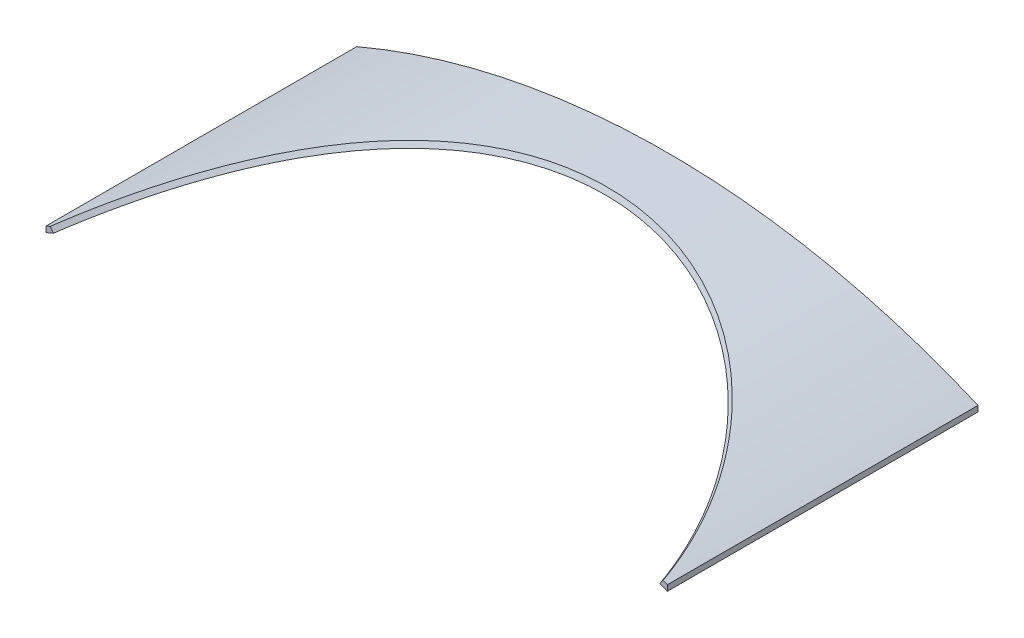
ISO-10303-21;
HEADER;
FILE_DESCRIPTION(('STEP AP214'),'2;1');
FILE_NAME('part.step','',(''),(''),'','','');
FILE_SCHEMA(('AUTOMOTIVE_DESIGN { 1 0 10303 214 1 1 1 1 }'));
ENDSEC;
DATA;
#1=APPLICATION_CONTEXT('core data for automotive mechanical design processes');
#2=APPLICATION_PROTOCOL_DEFINITION('international standard','automotive_design',2000,#1);
#3=PRODUCT_CONTEXT('',#1,'mechanical');
#4=PRODUCT('Part','Part','',(#3));
#5=PRODUCT_RELATED_PRODUCT_CATEGORY('part','',(#4));
#6=PRODUCT_DEFINITION_FORMATION('','',#4);
#7=PRODUCT_DEFINITION_CONTEXT('part definition',#1,'design');
#8=PRODUCT_DEFINITION('design','',#6,#7);
#9=PRODUCT_DEFINITION_SHAPE('','',#8);
#10=(LENGTH_UNIT() NAMED_UNIT(*) SI_UNIT(.MILLI.,.METRE.));
#11=(NAMED_UNIT(*) PLANE_ANGLE_UNIT() SI_UNIT($,.RADIAN.));
#12=(NAMED_UNIT(*) SI_UNIT($,.STERADIAN.) SOLID_ANGLE_UNIT());
#13=UNCERTAINTY_MEASURE_WITH_UNIT(LENGTH_MEASURE(1.E-05),#10,'distance_accuracy_value','');
#14=(GEOMETRIC_REPRESENTATION_CONTEXT(3) GLOBAL_UNCERTAINTY_ASSIGNED_CONTEXT((#13)) GLOBAL_UNIT_ASSIGNED_CONTEXT((#10,
#11,#12)) REPRESENTATION_CONTEXT('',''));
#15=CARTESIAN_POINT('',(0.,0.,0.));
#16=DIRECTION('',(0.,0.,1.));
#17=DIRECTION('',(1.,0.,0.));
#18=AXIS2_PLACEMENT_3D('',#15,#16,#17);
#19=CARTESIAN_POINT('',(0.,0.,118.));
#20=DIRECTION('',(0.,0.,1.));
#21=DIRECTION('',(1.,0.,0.));
#22=AXIS2_PLACEMENT_3D('',#19,#20,#21);
#23=PLANE('',#22);
#24=CARTESIAN_POINT('',(0.,363.,118.));
#25=DIRECTION('',(0.,0.,1.));
#26=DIRECTION('',(1.,0.,0.));
#27=AXIS2_PLACEMENT_3D('',#24,#25,#26);
#28=CIRCLE('',#27,145.041373407728);
#29=CARTESIAN_POINT('',(-116.417704250501,276.490358126722,118.));
#30=VERTEX_POINT('',#29);
#31=CARTESIAN_POINT('',(-115.175253329775,274.842975206612,118.));
#32=VERTEX_POINT('',#31);
#33=EDGE_CURVE('E11',#30,#32,#28,.T.);
#34=ORIENTED_EDGE('',*,*,#33,.F.);
#35=CARTESIAN_POINT('',(0.,0.,118.));
#36=DIRECTION('',(0.,0.,1.));
#37=DIRECTION('',(1.,0.,0.));
#38=AXIS2_PLACEMENT_3D('',#35,#36,#37);
#39=CIRCLE('',#38,300.);
#40=CARTESIAN_POINT('',(-118.,275.818781086423,118.));
#41=VERTEX_POINT('',#40);
#42=EDGE_CURVE('E106',#30,#41,#39,.T.);
#43=ORIENTED_EDGE('',*,*,#42,.T.);
#44=DIRECTION('',(0.,-1.,0.));
#45=VECTOR('',#44,1.);
#46=CARTESIAN_POINT('',(-118.,275.818781086423,118.));
#47=LINE('',#46,#45);
#48=CARTESIAN_POINT('',(-118.,273.642102023793,118.));
#49=VERTEX_POINT('',#48);
#50=EDGE_CURVE('E57',#41,#49,#47,.T.);
#51=ORIENTED_EDGE('',*,*,#50,.T.);
#52=CARTESIAN_POINT('',(0.,0.,118.));
#53=DIRECTION('',(0.,0.,-1.));
#54=DIRECTION('',(1.,0.,0.));
#55=AXIS2_PLACEMENT_3D('',#52,#53,#54);
#56=CIRCLE('',#55,298.);
#57=EDGE_CURVE('E140',#49,#32,#56,.T.);
#58=ORIENTED_EDGE('',*,*,#57,.T.);
#59=EDGE_LOOP('',(#34,#43,#51,#58));
#60=FACE_BOUND('',#59,.T.);
#61=ADVANCED_FACE('F33',(#60),#23,.T.);
#62=CARTESIAN_POINT('',(0.,0.,118.));
#63=DIRECTION('',(0.,0.,-1.));
#64=DIRECTION('',(-1.,0.,0.));
#65=AXIS2_PLACEMENT_3D('',#62,#63,#64);
#66=CYLINDRICAL_SURFACE('',#65,298.);
#67=CARTESIAN_POINT('',(115.175253329775,274.842975206611,118.));
#68=VERTEX_POINT('',#67);
#69=CARTESIAN_POINT('',(118.,273.642102023793,118.));
#70=VERTEX_POINT('',#69);
#71=EDGE_CURVE('E85',#68,#70,#56,.T.);
#72=ORIENTED_EDGE('',*,*,#71,.F.);
#73=CARTESIAN_POINT('',(115.175308549847,274.842952066171,118.0002));
#74=CARTESIAN_POINT('',(114.66897841973,275.055106732479,116.166314201416));
#75=CARTESIAN_POINT('',(114.128550269055,275.27995946752,114.343294599605));
#76=CARTESIAN_POINT('',(112.979586120452,275.753518994483,110.721934496561));
#77=CARTESIAN_POINT('',(112.371048376963,276.002226397747,108.923594629164));
#78=CARTESIAN_POINT('',(111.085798763114,276.522015120785,105.354133894913));
#79=CARTESIAN_POINT('',(110.409067795394,276.793102704216,103.583020813803));
#80=CARTESIAN_POINT('',(108.987734953418,277.35583300134,100.071568256163));
#81=CARTESIAN_POINT('',(108.243133547752,277.647475573113,98.3312285672654));
#82=CARTESIAN_POINT('',(106.683356711757,278.250540067916,94.8779249449304));
#83=CARTESIAN_POINT('',(105.867928179551,278.562031769986,93.1650874730216));
#84=CARTESIAN_POINT('',(104.169104167577,279.2017578783,89.7764484711956));
#85=CARTESIAN_POINT('',(103.28570284562,279.529993722868,88.1006501407236));
#86=CARTESIAN_POINT('',(101.451468470111,280.200915448368,84.7895945176731));
#87=CARTESIAN_POINT('',(100.500643627797,280.54359956765,83.154332320988));
#88=CARTESIAN_POINT('',(98.5319313079616,281.241087046759,79.9273291582587));
#89=CARTESIAN_POINT('',(97.5140439383907,281.595890387077,78.335588122165));
#90=CARTESIAN_POINT('',(95.4091877038589,282.316005834295,75.194975257715));
#91=CARTESIAN_POINT('',(94.3220543596696,282.681341741152,73.6462190732661));
#92=CARTESIAN_POINT('',(92.0817015594629,283.419037855295,70.5989767988226));
#93=CARTESIAN_POINT('',(90.9284821822012,283.79139805421,69.1004906489239));
#94=CARTESIAN_POINT('',(88.5567651981955,284.540411695003,66.1570189600167));
#95=CARTESIAN_POINT('',(87.3382632860796,284.917065418745,64.7120369602517));
#96=CARTESIAN_POINT('',(84.8371481893643,285.671777517457,61.8790699056484));
#97=CARTESIAN_POINT('',(83.5545361876319,286.04983586639,60.4910838000642));
#98=CARTESIAN_POINT('',(80.9282732982512,286.803902349031,57.7773423397922));
#99=CARTESIAN_POINT('',(79.5847087182512,287.179912586302,56.4515040833825));
#100=CARTESIAN_POINT('',(76.8365773617404,287.927365459398,53.8635710355947));
#101=CARTESIAN_POINT('',(75.432017405663,288.298808599982,52.6014691512489));
#102=CARTESIAN_POINT('',(72.5635522762699,289.034120787371,50.1442708899135));
#103=CARTESIAN_POINT('',(71.0996476279946,289.397989901143,48.9491739203338));
#104=CARTESIAN_POINT('',(68.1145637856306,290.115084447046,46.6293833573409));
#105=CARTESIAN_POINT('',(66.5933855410018,290.468310055447,45.5046885976488));
#106=CARTESIAN_POINT('',(63.5914902766043,291.139726036997,43.3960407858707));
#107=CARTESIAN_POINT('',(62.1140471429469,291.458734585268,42.407685855765));
#108=CARTESIAN_POINT('',(59.11308041912,292.082166760186,40.4986854790912));
#109=CARTESIAN_POINT('',(57.5895580335987,292.386590767578,39.5780382645983));
#110=CARTESIAN_POINT('',(54.4989004294266,292.978404324741,37.8070964153569));
#111=CARTESIAN_POINT('',(52.9317648387301,293.265793729132,36.9568023810076));
#112=CARTESIAN_POINT('',(49.7566798321898,293.821153265151,35.3291547475753));
#113=CARTESIAN_POINT('',(48.1487303843934,294.089123381576,34.5518012055985));
#114=CARTESIAN_POINT('',(44.8957577319608,294.603260832525,33.0728000747533));
#115=CARTESIAN_POINT('',(43.2507498499232,294.84943697796,32.371121866439));
#116=CARTESIAN_POINT('',(39.9263739012073,295.31796815764,31.0454175268877));
#117=CARTESIAN_POINT('',(38.247005584161,295.540323018237,30.4213919617028));
#118=CARTESIAN_POINT('',(34.8577455254764,295.959208144075,29.2531977386706));
#119=CARTESIAN_POINT('',(33.1478570668565,296.155741168153,28.7090205489965));
#120=CARTESIAN_POINT('',(29.7013116922524,296.521221423032,27.7023801482195));
#121=CARTESIAN_POINT('',(27.9646556628953,296.690169565391,27.2399142368758));
#122=CARTESIAN_POINT('',(24.6775334062865,296.980483022331,26.4486325062073));
#123=CARTESIAN_POINT('',(23.1296029995753,297.105121409583,26.1104510849546));
#124=CARTESIAN_POINT('',(20.0191601453432,297.33090058023,25.4997131737778));
#125=CARTESIAN_POINT('',(18.4566479928785,297.432041838012,25.2271553589623));
#126=CARTESIAN_POINT('',(15.3202299052758,297.610076435533,24.7484832704441));
#127=CARTESIAN_POINT('',(13.7463248602079,297.686971649019,24.5423638623165));
#128=CARTESIAN_POINT('',(10.5901548564037,297.815955090222,24.1971531598187));
#129=CARTESIAN_POINT('',(9.00788984887605,297.868043172995,24.058062257086));
#130=CARTESIAN_POINT('',(5.83898830585452,297.947003808544,23.8473802501396));
#131=CARTESIAN_POINT('',(4.25235416618387,297.973888165373,23.7757575474205));
#132=CARTESIAN_POINT('',(1.07724389004472,298.002281982863,23.7001168136886));
#133=CARTESIAN_POINT('',(-0.511232249727341,298.003791397944,23.6960989041108));
#134=CARTESIAN_POINT('',(-3.68669682485292,297.981424351142,23.7556791833742));
#135=CARTESIAN_POINT('',(-5.27368529417565,297.957548483767,23.819275788723));
#136=CARTESIAN_POINT('',(-8.44292612764633,297.884590485192,24.0138897458434));
#137=CARTESIAN_POINT('',(-10.025178556367,297.835508699247,24.1449061741402));
#138=CARTESIAN_POINT('',(-13.074560546064,297.716683402206,24.4627890818848));
#139=CARTESIAN_POINT('',(-14.5422140612284,297.648568576704,24.6452607389529));
#140=CARTESIAN_POINT('',(-17.4681710414628,297.491192526169,25.0679783544484));
#141=CARTESIAN_POINT('',(-18.9264736799133,297.401929457389,25.3082293502205));
#142=CARTESIAN_POINT('',(-21.8308584568609,297.202846740326,25.8458388609386));
#143=CARTESIAN_POINT('',(-23.2769424507262,297.093030273856,26.1431885367816));
#144=CARTESIAN_POINT('',(-26.1548287598421,296.853516138368,26.794299323173));
#145=CARTESIAN_POINT('',(-27.5866297363467,296.723816624019,27.1480656698322));
#146=CARTESIAN_POINT('',(-30.433392240496,296.445364175026,27.9110908948503));
#147=CARTESIAN_POINT('',(-31.848354799112,296.296612413529,28.3203463565456));
#148=CARTESIAN_POINT('',(-34.6594288811817,295.98095318385,29.1934154377221));
#149=CARTESIAN_POINT('',(-36.0555386946594,295.814044081038,29.6572339696029));
#150=CARTESIAN_POINT('',(-38.8265728514221,295.463106983027,30.6382736830924));
#151=CARTESIAN_POINT('',(-40.2014985699297,295.27908010458,31.1554913812208));
#152=CARTESIAN_POINT('',(-42.9283868634086,294.894980785821,32.242216320245));
#153=CARTESIAN_POINT('',(-44.2803473225009,294.694906876647,32.8117283485886));
#154=CARTESIAN_POINT('',(-46.9892501676626,294.275263412604,34.015035633433));
#155=CARTESIAN_POINT('',(-48.345628770466,294.055358110557,34.649982992217));
#156=CARTESIAN_POINT('',(-51.0305571116408,293.601322000853,35.9717911704633));
#157=CARTESIAN_POINT('',(-52.3591043228227,293.367189908818,36.6586566784066));
#158=CARTESIAN_POINT('',(-54.986431242957,292.886113701658,38.0827107669379));
#159=CARTESIAN_POINT('',(-56.2852136701616,292.639170763252,38.819894727562));
#160=CARTESIAN_POINT('',(-58.8515908208503,292.13387602647,40.3430982766483));
#161=CARTESIAN_POINT('',(-60.1191828652749,291.875523253351,41.1291220398456));
#162=CARTESIAN_POINT('',(-63.8728544254236,291.085543157303,43.5580574129447));
#163=CARTESIAN_POINT('',(-66.3102973691088,290.538907536634,45.2720872873599));
#164=CARTESIAN_POINT('',(-71.0441687898318,289.417772420198,48.8759716155518));
#165=CARTESIAN_POINT('',(-73.3405914560676,288.843271777985,50.7658333064959));
#166=CARTESIAN_POINT('',(-77.9866673615267,287.625377945395,54.8874589636108));
#167=CARTESIAN_POINT('',(-80.322223125304,286.980465632099,57.134686435436));
#168=CARTESIAN_POINT('',(-84.8083805247498,285.686875621639,61.8056719149378));
#169=CARTESIAN_POINT('',(-86.9589689697821,285.038197659449,64.2294424897658));
#170=CARTESIAN_POINT('',(-91.070935013764,283.751177498344,69.2385958184851));
#171=CARTESIAN_POINT('',(-93.0321451491043,283.112844855178,71.8241183373784));
#172=CARTESIAN_POINT('',(-96.758806453462,281.860955147733,77.1379981270734));
#173=CARTESIAN_POINT('',(-98.5242648585508,281.247397168178,79.8663501126124));
#174=CARTESIAN_POINT('',(-101.828410226228,280.067849781153,85.4024612527316));
#175=CARTESIAN_POINT('',(-103.370411650803,279.501233911959,88.2081132659726));
#176=CARTESIAN_POINT('',(-106.260577033823,278.415290833082,93.9267572425969));
#177=CARTESIAN_POINT('',(-107.608733267477,277.895965508245,96.8397534778729));
#178=CARTESIAN_POINT('',(-109.482908881385,277.160495483992,101.274349357237));
#179=CARTESIAN_POINT('',(-110.082406286102,276.922818315896,102.761804461528));
#180=CARTESIAN_POINT('',(-111.232738180094,276.462767717848,105.757834393601));
#181=CARTESIAN_POINT('',(-111.783572478272,276.240394347993,107.266409304293));
#182=CARTESIAN_POINT('',(-112.836373379096,275.812030628929,110.302535508962));
#183=CARTESIAN_POINT('',(-113.338347181424,275.606037866828,111.830083969633));
#184=CARTESIAN_POINT('',(-114.293462059005,275.211317907298,114.902555265956));
#185=CARTESIAN_POINT('',(-114.746603859006,275.022590453631,116.447477843373));
#186=CARTESIAN_POINT('',(-115.175308549847,274.842952066171,118.0002));
#187=B_SPLINE_CURVE_WITH_KNOTS('',3,(#73,#74,#75,#76,#77,#78,#79,#80,#81,#82,#83,#84,#85,#86,
#87,#88,#89,#90,#91,#92,#93,#94,#95,#96,#97,#98,#99,#100,#101,#102,#103,#104,#105,#106,#107,
#108,#109,#110,#111,#112,#113,#114,#115,#116,#117,#118,#119,#120,#121,#122,#123,#124,#125,#126,
#127,#128,#129,#130,#131,#132,#133,#134,#135,#136,#137,#138,#139,#140,#141,#142,#143,#144,#145,
#146,#147,#148,#149,#150,#151,#152,#153,#154,#155,#156,#157,#158,#159,#160,#161,#162,#163,#164,
#165,#166,#167,#168,#169,#170,#171,#172,#173,#174,#175,#176,#177,#178,#179,#180,#181,#182,#183,
#184,#185,#186),.UNSPECIFIED.,.F.,.F.,(4,2,2,2,2,2,2,2,2,2,2,2,2,2,2,2,2,2,2,2,2,2,2,2,2,2,2,2,
2,2,2,2,2,2,2,2,2,2,2,2,2,2,2,2,2,2,2,2,2,2,2,2,2,2,2,2,4),(0.,5.74252717555168,
11.4852015584251,17.2294886576759,22.9737361002848,28.7394290521477,34.5056181140294,
40.2711061372484,46.0365848800763,51.8163095728418,57.5960273779804,63.3761268248623,
69.1561196650277,74.9281691113892,80.6995747873305,86.4709294130242,92.2421884054708,
97.6581698371427,103.074009801199,108.489895979666,113.905786398275,119.31947717437,
124.733207411468,130.146358767708,135.559331206823,140.325793708451,145.0921599707,
149.858157795159,154.62418346629,159.387975873848,164.151776838363,168.915466239902,
173.679090393118,178.119357329434,182.560011519554,186.999978832099,191.44035846436,
195.880464810606,200.320971213044,204.761188123054,209.201811932631,213.7416672392,
218.281933009445,222.821782476707,227.362020537092,236.440882342242,245.520117995182,
255.423689178059,265.327966033034,275.240922349901,285.153512106573,294.899393636167,
304.645663434618,309.508610139681,314.371575940415,319.233824086072,324.096000058019),.UNSPECIFIED.);
#188=EDGE_CURVE('E48',#68,#32,#187,.T.);
#189=ORIENTED_EDGE('',*,*,#188,.T.);
#190=ORIENTED_EDGE('',*,*,#57,.F.);
#191=DIRECTION('',(0.,0.,-1.));
#192=VECTOR('',#191,1.);
#193=CARTESIAN_POINT('',(-118.,273.642102023793,118.));
#194=LINE('',#193,#192);
#195=CARTESIAN_POINT('',(-118.,273.642102023793,0.));
#196=VERTEX_POINT('',#195);
#197=EDGE_CURVE('E112',#49,#196,#194,.T.);
#198=ORIENTED_EDGE('',*,*,#197,.T.);
#199=CARTESIAN_POINT('',(0.,0.,0.));
#200=DIRECTION('',(0.,0.,-1.));
#201=DIRECTION('',(1.,0.,0.));
#202=AXIS2_PLACEMENT_3D('',#199,#200,#201);
#203=CIRCLE('',#202,298.);
#204=CARTESIAN_POINT('',(118.,273.642102023793,0.));
#205=VERTEX_POINT('',#204);
#206=EDGE_CURVE('E117',#196,#205,#203,.T.);
#207=ORIENTED_EDGE('',*,*,#206,.T.);
#208=DIRECTION('',(0.,0.,-1.));
#209=VECTOR('',#208,1.);
#210=CARTESIAN_POINT('',(118.,273.642102023793,118.));
#211=LINE('',#210,#209);
#212=EDGE_CURVE('E98',#70,#205,#211,.T.);
#213=ORIENTED_EDGE('',*,*,#212,.F.);
#214=EDGE_LOOP('',(#72,#189,#190,#198,#207,#213));
#215=FACE_BOUND('',#214,.T.);
#216=ADVANCED_FACE('F35',(#215),#66,.F.);
#217=CARTESIAN_POINT('',(118.,275.818781086423,118.));
#218=DIRECTION('',(-1.,0.,0.));
#219=DIRECTION('',(0.,0.,1.));
#220=AXIS2_PLACEMENT_3D('',#217,#218,#219);
#221=PLANE('',#220);
#222=DIRECTION('',(0.,1.,0.));
#223=VECTOR('',#222,1.);
#224=CARTESIAN_POINT('',(118.,275.818781086423,0.));
#225=LINE('',#224,#223);
#226=CARTESIAN_POINT('',(118.,275.818781086423,0.));
#227=VERTEX_POINT('',#226);
#228=EDGE_CURVE('E120',#205,#227,#225,.T.);
#229=ORIENTED_EDGE('',*,*,#228,.T.);
#230=DIRECTION('',(0.,0.,-1.));
#231=VECTOR('',#230,1.);
#232=CARTESIAN_POINT('',(118.,275.818781086423,118.));
#233=LINE('',#232,#231);
#234=CARTESIAN_POINT('',(118.,275.818781086423,118.));
#235=VERTEX_POINT('',#234);
#236=EDGE_CURVE('E128',#235,#227,#233,.T.);
#237=ORIENTED_EDGE('',*,*,#236,.F.);
#238=DIRECTION('',(0.,1.,0.));
#239=VECTOR('',#238,1.);
#240=CARTESIAN_POINT('',(118.,275.818781086423,118.));
#241=LINE('',#240,#239);
#242=EDGE_CURVE('E109',#70,#235,#241,.T.);
#243=ORIENTED_EDGE('',*,*,#242,.F.);
#244=ORIENTED_EDGE('',*,*,#212,.T.);
#245=EDGE_LOOP('',(#229,#237,#243,#244));
#246=FACE_BOUND('',#245,.T.);
#247=ADVANCED_FACE('F132',(#246),#221,.F.);
#248=CARTESIAN_POINT('',(0.,0.,118.));
#249=DIRECTION('',(0.,0.,-1.));
#250=DIRECTION('',(-1.,0.,0.));
#251=AXIS2_PLACEMENT_3D('',#248,#249,#250);
#252=CYLINDRICAL_SURFACE('',#251,300.);
#253=ORIENTED_EDGE('',*,*,#42,.F.);
#254=CARTESIAN_POINT('',(-116.417759208697,276.490334986281,118.0002));
#255=CARTESIAN_POINT('',(-115.909658106234,276.704245998477,116.151129075709));
#256=CARTESIAN_POINT('',(-115.367084597402,276.931077552628,114.313009154518));
#257=CARTESIAN_POINT('',(-114.213101238512,277.409015054603,110.661654932138));
#258=CARTESIAN_POINT('',(-113.601689715243,277.660121592447,108.84842123705));
#259=CARTESIAN_POINT('',(-112.309990853207,278.18510199247,105.249432201249));
#260=CARTESIAN_POINT('',(-111.629685142222,278.458981924197,103.463684337294));
#261=CARTESIAN_POINT('',(-110.200516475354,279.027665135899,99.9232309283157));
#262=CARTESIAN_POINT('',(-109.451653972854,279.322468277502,98.1685251780942));
#263=CARTESIAN_POINT('',(-107.882800184475,279.932156240128,94.6870103766582));
#264=CARTESIAN_POINT('',(-107.062564282148,280.247109058601,92.9603234221132));
#265=CARTESIAN_POINT('',(-105.353503848429,280.894062127361,89.5442927934284));
#266=CARTESIAN_POINT('',(-104.464673393958,281.226063848975,87.8549523603664));
#267=CARTESIAN_POINT('',(-102.618984305304,281.904790139616,84.5171370283097));
#268=CARTESIAN_POINT('',(-101.662133788835,282.251512949803,82.8686572844443));
#269=CARTESIAN_POINT('',(-99.680801850174,282.957317721015,79.6155589539896));
#270=CARTESIAN_POINT('',(-98.6563205182491,283.316399665545,78.0109403088635));
#271=CARTESIAN_POINT('',(-96.5377932647405,284.045264488306,74.8450009694068));
#272=CARTESIAN_POINT('',(-95.4435862378614,284.415070987589,73.2837934732279));
#273=CARTESIAN_POINT('',(-93.1885804651262,285.161882272405,70.2119965670364));
#274=CARTESIAN_POINT('',(-92.0277817948095,285.538887049773,68.7014070996074));
#275=CARTESIAN_POINT('',(-89.6404301568817,286.297331430915,65.7340778820446));
#276=CARTESIAN_POINT('',(-88.4138729713182,286.678771317939,64.2773415963686));
#277=CARTESIAN_POINT('',(-85.8961966181232,287.443166635782,61.421207279881));
#278=CARTESIAN_POINT('',(-84.6050786161198,287.826122039123,60.0218082146905));
#279=CARTESIAN_POINT('',(-81.9613360723273,288.590072651328,57.2855311049513));
#280=CARTESIAN_POINT('',(-80.6087957858989,288.971069792271,55.9485722309266));
#281=CARTESIAN_POINT('',(-77.8423088397255,289.728547835884,53.3387209949354));
#282=CARTESIAN_POINT('',(-76.4283690047453,290.105029234587,52.0658215463339));
#283=CARTESIAN_POINT('',(-73.5407595286892,290.850442800391,49.5873319122016));
#284=CARTESIAN_POINT('',(-72.0670903252029,291.219375022769,48.3817412337068));
#285=CARTESIAN_POINT('',(-69.0621132825557,291.946594396784,46.0412484190726));
#286=CARTESIAN_POINT('',(-67.5308063712616,292.304881719619,44.9063451457693));
#287=CARTESIAN_POINT('',(-64.5069161535038,292.98654065106,42.776738447578));
#288=CARTESIAN_POINT('',(-63.0175602946515,293.310715223798,41.7777077091788));
#289=CARTESIAN_POINT('',(-59.9923446700995,293.944393975414,39.8477580862211));
#290=CARTESIAN_POINT('',(-58.4564860943457,294.253898529159,38.9168374608895));
#291=CARTESIAN_POINT('',(-55.340749896923,294.855759413059,37.1257413928795));
#292=CARTESIAN_POINT('',(-53.7608719124898,295.148115601831,36.2655665334482));
#293=CARTESIAN_POINT('',(-50.5599098265584,295.71326788617,34.6185391029432));
#294=CARTESIAN_POINT('',(-48.9388256929827,295.986063966508,33.8316865889505));
#295=CARTESIAN_POINT('',(-45.6591824433908,296.509688640308,32.3340509776227));
#296=CARTESIAN_POINT('',(-44.0006381993047,296.76052576528,31.6232383131841));
#297=CARTESIAN_POINT('',(-40.6488177756328,297.238186020483,30.2796297520881));
#298=CARTESIAN_POINT('',(-38.955541350211,297.465008980671,29.646834407863));
#299=CARTESIAN_POINT('',(-35.5380961233417,297.892612937445,28.4614570080418));
#300=CARTESIAN_POINT('',(-33.8139305446802,298.093396633008,27.9088666384726));
#301=CARTESIAN_POINT('',(-30.3384704080606,298.467136298916,26.8857529161878));
#302=CARTESIAN_POINT('',(-28.5871767228174,298.640093162426,26.4152269293949));
#303=CARTESIAN_POINT('',(-25.2676710713524,298.938100924362,25.6080196485516));
#304=CARTESIAN_POINT('',(-23.7019832299929,299.066388267021,25.2621225792956));
#305=CARTESIAN_POINT('',(-20.5556734136244,299.299101904684,24.6366154293313));
#306=CARTESIAN_POINT('',(-18.9750517347404,299.403528671793,24.3570040370931));
#307=CARTESIAN_POINT('',(-15.8020898722498,299.587748745217,23.8648974893144));
#308=CARTESIAN_POINT('',(-14.2097505782947,299.66754390231,23.6523972911242));
#309=CARTESIAN_POINT('',(-11.0164202503491,299.801921796589,23.2951092304106));
#310=CARTESIAN_POINT('',(-9.41542916728503,299.856504390615,23.1503217523677));
#311=CARTESIAN_POINT('',(-6.20881905613056,299.940030167574,22.928944862068));
#312=CARTESIAN_POINT('',(-4.6032025276388,299.968985267012,22.8523237531072));
#313=CARTESIAN_POINT('',(-1.3899014055805,300.001082907431,22.7673945404726));
#314=CARTESIAN_POINT('',(0.217783191710283,300.004225401863,22.7590865599923));
#315=CARTESIAN_POINT('',(3.43185474055871,299.984674614598,22.8108079050967));
#316=CARTESIAN_POINT('',(5.0382417217895,299.961981941443,22.8708356210507));
#317=CARTESIAN_POINT('',(8.24643329297494,299.890931204567,23.0590458180021));
#318=CARTESIAN_POINT('',(9.84823794481163,299.8425734891,23.1872273742064));
#319=CARTESIAN_POINT('',(12.9366036399015,299.724655858282,23.5004656412267));
#320=CARTESIAN_POINT('',(14.4236760591167,299.656738968288,23.6811218638975));
#321=CARTESIAN_POINT('',(17.3885244108305,299.49932075344,24.1009530908196));
#322=CARTESIAN_POINT('',(18.8662995201379,299.409817544165,24.340133204064));
#323=CARTESIAN_POINT('',(21.8096398507606,299.209817914227,24.8763542145325));
#324=CARTESIAN_POINT('',(23.2752069159772,299.099324726184,25.1733862022979));
#325=CARTESIAN_POINT('',(26.1920337641221,298.858025006654,25.8246215893101));
#326=CARTESIAN_POINT('',(27.6432922045081,298.727216587971,26.1788303001446));
#327=CARTESIAN_POINT('',(30.528899410774,298.446121834534,26.9435059857855));
#328=CARTESIAN_POINT('',(31.9632492226855,298.295836711654,27.3539694604131));
#329=CARTESIAN_POINT('',(34.8129908674993,297.976696413461,28.230225229714));
#330=CARTESIAN_POINT('',(36.2283809771499,297.807839562833,28.6960225162276));
#331=CARTESIAN_POINT('',(39.0378234298865,297.452606354913,29.681792887494));
#332=CARTESIAN_POINT('',(40.4318771737889,297.266231153556,30.2017623979761));
#333=CARTESIAN_POINT('',(43.1968325806559,296.877050307098,31.2947662890259));
#334=CARTESIAN_POINT('',(44.5677321086568,296.674243156756,31.8678055317117));
#335=CARTESIAN_POINT('',(47.3133231105403,296.248915904018,33.078421474204));
#336=CARTESIAN_POINT('',(48.6874716938789,296.026067583954,33.7171140840594));
#337=CARTESIAN_POINT('',(51.4077149083198,295.565813377161,35.0471178502805));
#338=CARTESIAN_POINT('',(52.7538069910219,295.328406175688,35.738433760171));
#339=CARTESIAN_POINT('',(55.4159580220606,294.840469602354,37.1720933157677));
#340=CARTESIAN_POINT('',(56.732019729263,294.589941442929,37.9144322486866));
#341=CARTESIAN_POINT('',(59.3326560962965,294.077189477125,39.4486495052797));
#342=CARTESIAN_POINT('',(60.617228046143,293.814964669579,40.2405320719552));
#343=CARTESIAN_POINT('',(64.4213220783621,293.012979014905,42.6880874204868));
#344=CARTESIAN_POINT('',(66.8917117156586,292.457816372996,44.4159319189498));
#345=CARTESIAN_POINT('',(71.6898559835666,291.318809653083,48.0502002945846));
#346=CARTESIAN_POINT('',(74.0176047716434,290.734964402007,49.9566314785471));
#347=CARTESIAN_POINT('',(78.7228641050796,289.498085215037,54.1118539723119));
#348=CARTESIAN_POINT('',(81.0864166287136,288.843513245807,56.3760140296086));
#349=CARTESIAN_POINT('',(85.6267116735761,287.530265522907,61.0833066686516));
#350=CARTESIAN_POINT('',(87.8034412225902,286.871589487667,63.5264516565744));
#351=CARTESIAN_POINT('',(91.965603048914,285.564512384477,68.576715156287));
#352=CARTESIAN_POINT('',(93.950867174892,284.916120758699,71.1839745373441));
#353=CARTESIAN_POINT('',(97.723319422351,283.644347610518,76.5435666301665));
#354=CARTESIAN_POINT('',(99.510514311164,283.020965234101,79.2958943807098));
#355=CARTESIAN_POINT('',(102.864405630974,281.819182227574,84.896868552218));
#356=CARTESIAN_POINT('',(104.43338397695,281.240349735361,87.7440588084915));
#357=CARTESIAN_POINT('',(107.372725043662,280.131338348487,93.5487276170805));
#358=CARTESIAN_POINT('',(108.743079191312,279.601161554283,96.5062109229792));
#359=CARTESIAN_POINT('',(110.646860579997,278.850739070496,101.009430871994));
#360=CARTESIAN_POINT('',(111.255625673464,278.608293738475,102.520114767127));
#361=CARTESIAN_POINT('',(112.423237470312,278.139194969567,105.563159029541));
#362=CARTESIAN_POINT('',(112.982083978245,277.912541594513,107.095519481666));
#363=CARTESIAN_POINT('',(114.049635617411,277.476149591488,110.179704528013));
#364=CARTESIAN_POINT('',(114.558348136753,277.266408472034,111.731526216177));
#365=CARTESIAN_POINT('',(115.525655150286,276.864759602353,114.852971623125));
#366=CARTESIAN_POINT('',(115.984250370542,276.672851593778,116.422595083646));
#367=CARTESIAN_POINT('',(116.417759208697,276.490334986281,118.0002));
#368=B_SPLINE_CURVE_WITH_KNOTS('',3,(#254,#255,#256,#257,#258,#259,#260,#261,#262,#263,#264,
#265,#266,#267,#268,#269,#270,#271,#272,#273,#274,#275,#276,#277,#278,#279,#280,#281,#282,#283,
#284,#285,#286,#287,#288,#289,#290,#291,#292,#293,#294,#295,#296,#297,#298,#299,#300,#301,#302,
#303,#304,#305,#306,#307,#308,#309,#310,#311,#312,#313,#314,#315,#316,#317,#318,#319,#320,#321,
#322,#323,#324,#325,#326,#327,#328,#329,#330,#331,#332,#333,#334,#335,#336,#337,#338,#339,#340,
#341,#342,#343,#344,#345,#346,#347,#348,#349,#350,#351,#352,#353,#354,#355,#356,#357,#358,#359,
#360,#361,#362,#363,#364,#365,#366,#367),.UNSPECIFIED.,.F.,.F.,(4,2,2,2,2,2,2,2,2,2,2,2,2,2,2,2,
2,2,2,2,2,2,2,2,2,2,2,2,2,2,2,2,2,2,2,2,2,2,2,2,2,2,2,2,2,2,2,2,2,2,2,2,2,2,2,2,4),(0.,
5.78815572251378,11.5764521653234,17.3662962755946,23.1561020990206,28.966597850053,
34.7775958947667,40.5879015984842,46.3981995474225,52.2224468215436,58.0466874889554,
63.8713021889931,69.6958117651211,75.5125596940344,81.3286627187425,87.144723141188,
92.9606899751926,98.4261728144309,103.891515916843,109.3569040725,114.82229648289,
120.285555962506,125.748854124658,131.211585561326,136.674141624637,141.498272565055,
146.32230804714,151.14598097105,155.969681283981,160.791137448706,165.612602308275,
170.43395360177,175.255239475059,179.752558987674,184.250271245486,188.74729138154,
193.244729521236,197.74188795669,202.239452403751,206.736720290264,211.234400613768,
215.828021071974,220.422056970884,225.015669106304,229.609675186433,238.7960017043,
247.982704240719,257.98572997526,267.98944971756,278.001876549048,288.013961185455,
297.911880406338,307.810226717442,312.749459687081,317.688711994619,322.627235326091,
327.5656871021),.UNSPECIFIED.);
#369=CARTESIAN_POINT('',(116.417704250501,276.490358126722,118.));
#370=VERTEX_POINT('',#369);
#371=EDGE_CURVE('E95',#30,#370,#368,.T.);
#372=ORIENTED_EDGE('',*,*,#371,.T.);
#373=EDGE_CURVE('E104',#235,#370,#39,.T.);
#374=ORIENTED_EDGE('',*,*,#373,.F.);
#375=ORIENTED_EDGE('',*,*,#236,.T.);
#376=CARTESIAN_POINT('',(0.,0.,0.));
#377=DIRECTION('',(0.,0.,1.));
#378=DIRECTION('',(1.,0.,0.));
#379=AXIS2_PLACEMENT_3D('',#376,#377,#378);
#380=CIRCLE('',#379,300.);
#381=CARTESIAN_POINT('',(-118.,275.818781086423,0.));
#382=VERTEX_POINT('',#381);
#383=EDGE_CURVE('E122',#227,#382,#380,.T.);
#384=ORIENTED_EDGE('',*,*,#383,.T.);
#385=DIRECTION('',(0.,0.,-1.));
#386=VECTOR('',#385,1.);
#387=CARTESIAN_POINT('',(-118.,275.818781086423,118.));
#388=LINE('',#387,#386);
#389=EDGE_CURVE('E126',#41,#382,#388,.T.);
#390=ORIENTED_EDGE('',*,*,#389,.F.);
#391=EDGE_LOOP('',(#253,#372,#374,#375,#384,#390));
#392=FACE_BOUND('',#391,.T.);
#393=ADVANCED_FACE('F102',(#392),#252,.T.);
#394=CARTESIAN_POINT('',(-118.,275.818781086423,118.));
#395=DIRECTION('',(1.,0.,0.));
#396=DIRECTION('',(0.,0.,-1.));
#397=AXIS2_PLACEMENT_3D('',#394,#395,#396);
#398=PLANE('',#397);
#399=DIRECTION('',(0.,-1.,0.));
#400=VECTOR('',#399,1.);
#401=CARTESIAN_POINT('',(-118.,275.818781086423,0.));
#402=LINE('',#401,#400);
#403=EDGE_CURVE('E78',#382,#196,#402,.T.);
#404=ORIENTED_EDGE('',*,*,#403,.T.);
#405=ORIENTED_EDGE('',*,*,#197,.F.);
#406=ORIENTED_EDGE('',*,*,#50,.F.);
#407=ORIENTED_EDGE('',*,*,#389,.T.);
#408=EDGE_LOOP('',(#404,#405,#406,#407));
#409=FACE_BOUND('',#408,.T.);
#410=ADVANCED_FACE('F139',(#409),#398,.F.);
#411=EDGE_CURVE('E38',#68,#370,#28,.T.);
#412=ORIENTED_EDGE('',*,*,#411,.F.);
#413=ORIENTED_EDGE('',*,*,#71,.T.);
#414=ORIENTED_EDGE('',*,*,#242,.T.);
#415=ORIENTED_EDGE('',*,*,#373,.T.);
#416=EDGE_LOOP('',(#412,#413,#414,#415));
#417=FACE_BOUND('',#416,.T.);
#418=ADVANCED_FACE('F108',(#417),#23,.T.);
#419=CARTESIAN_POINT('',(0.,0.,0.));
#420=DIRECTION('',(0.,0.,1.));
#421=DIRECTION('',(1.,0.,0.));
#422=AXIS2_PLACEMENT_3D('',#419,#420,#421);
#423=PLANE('',#422);
#424=ORIENTED_EDGE('',*,*,#206,.F.);
#425=ORIENTED_EDGE('',*,*,#403,.F.);
#426=ORIENTED_EDGE('',*,*,#383,.F.);
#427=ORIENTED_EDGE('',*,*,#228,.F.);
#428=EDGE_LOOP('',(#424,#425,#426,#427));
#429=FACE_BOUND('',#428,.T.);
#430=ADVANCED_FACE('F137',(#429),#423,.F.);
#431=CARTESIAN_POINT('',(0.,363.,160.));
#432=DIRECTION('',(-1.,0.,0.));
#433=DIRECTION('',(0.,0.,1.));
#434=AXIS2_PLACEMENT_3D('',#431,#432,#433);
#435=SPHERICAL_SURFACE('',#434,151.);
#436=ORIENTED_EDGE('',*,*,#33,.T.);
#437=ORIENTED_EDGE('',*,*,#188,.F.);
#438=ORIENTED_EDGE('',*,*,#411,.T.);
#439=ORIENTED_EDGE('',*,*,#371,.F.);
#440=EDGE_LOOP('',(#436,#437,#438,#439));
#441=FACE_BOUND('',#440,.T.);
#442=ADVANCED_FACE('F94',(#441),#435,.F.);
#443=CLOSED_SHELL('',(#61,#216,#247,#393,#410,#418,#430,#442));
#444=MANIFOLD_SOLID_BREP('B2',#443);
#445=ADVANCED_BREP_SHAPE_REPRESENTATION('',(#18,#444),#14);
#446=SHAPE_DEFINITION_REPRESENTATION(#9,#445);
ENDSEC;
END-ISO-10303-21;
